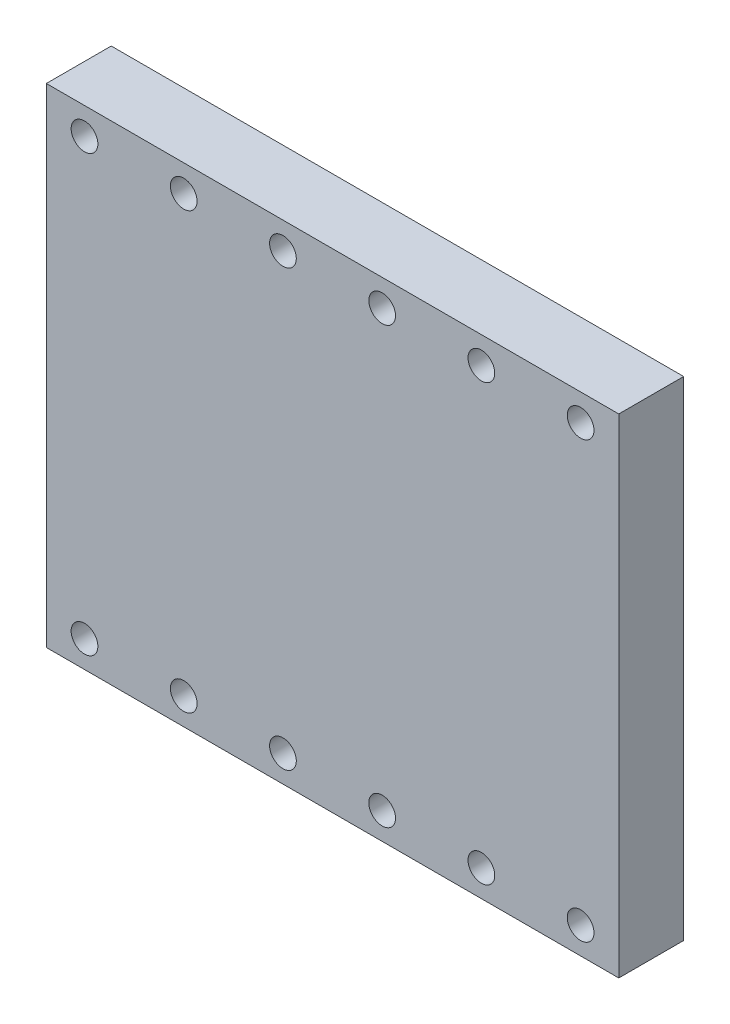
ISO-10303-21;
HEADER;
FILE_DESCRIPTION(('STEP AP214'),'2;1');
FILE_NAME('part.step','',(''),(''),'','','');
FILE_SCHEMA(('AUTOMOTIVE_DESIGN { 1 0 10303 214 1 1 1 1 }'));
ENDSEC;
DATA;
#1=APPLICATION_CONTEXT('core data for automotive mechanical design processes');
#2=APPLICATION_PROTOCOL_DEFINITION('international standard','automotive_design',2000,#1);
#3=PRODUCT_CONTEXT('',#1,'mechanical');
#4=PRODUCT('Part','Part','',(#3));
#5=PRODUCT_RELATED_PRODUCT_CATEGORY('part','',(#4));
#6=PRODUCT_DEFINITION_FORMATION('','',#4);
#7=PRODUCT_DEFINITION_CONTEXT('part definition',#1,'design');
#8=PRODUCT_DEFINITION('design','',#6,#7);
#9=PRODUCT_DEFINITION_SHAPE('','',#8);
#10=(LENGTH_UNIT() NAMED_UNIT(*) SI_UNIT(.MILLI.,.METRE.));
#11=(NAMED_UNIT(*) PLANE_ANGLE_UNIT() SI_UNIT($,.RADIAN.));
#12=(NAMED_UNIT(*) SI_UNIT($,.STERADIAN.) SOLID_ANGLE_UNIT());
#13=UNCERTAINTY_MEASURE_WITH_UNIT(LENGTH_MEASURE(1.E-05),#10,'distance_accuracy_value','');
#14=(GEOMETRIC_REPRESENTATION_CONTEXT(3) GLOBAL_UNCERTAINTY_ASSIGNED_CONTEXT((#13)) GLOBAL_UNIT_ASSIGNED_CONTEXT((#10,
#11,#12)) REPRESENTATION_CONTEXT('',''));
#15=CARTESIAN_POINT('',(0.,0.,0.));
#16=DIRECTION('',(0.,0.,1.));
#17=DIRECTION('',(1.,0.,0.));
#18=AXIS2_PLACEMENT_3D('',#15,#16,#17);
#19=CARTESIAN_POINT('',(0.,0.,0.));
#20=DIRECTION('',(0.,0.,-1.));
#21=DIRECTION('',(-1.,0.,0.));
#22=AXIS2_PLACEMENT_3D('',#19,#20,#21);
#23=PLANE('',#22);
#24=CARTESIAN_POINT('',(1.3,5.7,0.));
#25=DIRECTION('',(0.,0.,1.));
#26=DIRECTION('',(1.,0.,0.));
#27=AXIS2_PLACEMENT_3D('',#24,#25,#26);
#28=CIRCLE('',#27,0.35);
#29=CARTESIAN_POINT('',(1.65,5.7,0.));
#30=VERTEX_POINT('',#29);
#31=EDGE_CURVE('E476',#30,#30,#28,.T.);
#32=ORIENTED_EDGE('',*,*,#31,.T.);
#33=EDGE_LOOP('',(#32));
#34=FACE_BOUND('',#33,.T.);
#35=CARTESIAN_POINT('',(3.9,5.7,0.));
#36=DIRECTION('',(0.,0.,1.));
#37=DIRECTION('',(1.,0.,0.));
#38=AXIS2_PLACEMENT_3D('',#35,#36,#37);
#39=CIRCLE('',#38,0.35);
#40=CARTESIAN_POINT('',(4.25,5.7,0.));
#41=VERTEX_POINT('',#40);
#42=EDGE_CURVE('E472',#41,#41,#39,.T.);
#43=ORIENTED_EDGE('',*,*,#42,.T.);
#44=EDGE_LOOP('',(#43));
#45=FACE_BOUND('',#44,.T.);
#46=CARTESIAN_POINT('',(6.5,5.7,0.));
#47=DIRECTION('',(0.,0.,1.));
#48=DIRECTION('',(1.,0.,0.));
#49=AXIS2_PLACEMENT_3D('',#46,#47,#48);
#50=CIRCLE('',#49,0.350000000000001);
#51=CARTESIAN_POINT('',(6.85,5.7,0.));
#52=VERTEX_POINT('',#51);
#53=EDGE_CURVE('E466',#52,#52,#50,.T.);
#54=ORIENTED_EDGE('',*,*,#53,.T.);
#55=EDGE_LOOP('',(#54));
#56=FACE_BOUND('',#55,.T.);
#57=CARTESIAN_POINT('',(-6.5,5.7,0.));
#58=DIRECTION('',(0.,0.,1.));
#59=DIRECTION('',(1.,0.,0.));
#60=AXIS2_PLACEMENT_3D('',#57,#58,#59);
#61=CIRCLE('',#60,0.35);
#62=CARTESIAN_POINT('',(-6.15,5.7,0.));
#63=VERTEX_POINT('',#62);
#64=EDGE_CURVE('E458',#63,#63,#61,.T.);
#65=ORIENTED_EDGE('',*,*,#64,.T.);
#66=EDGE_LOOP('',(#65));
#67=FACE_BOUND('',#66,.T.);
#68=CARTESIAN_POINT('',(-3.9,5.7,0.));
#69=DIRECTION('',(0.,0.,1.));
#70=DIRECTION('',(1.,0.,0.));
#71=AXIS2_PLACEMENT_3D('',#68,#69,#70);
#72=CIRCLE('',#71,0.35);
#73=CARTESIAN_POINT('',(-3.55,5.7,0.));
#74=VERTEX_POINT('',#73);
#75=EDGE_CURVE('E452',#74,#74,#72,.T.);
#76=ORIENTED_EDGE('',*,*,#75,.T.);
#77=EDGE_LOOP('',(#76));
#78=FACE_BOUND('',#77,.T.);
#79=CARTESIAN_POINT('',(-1.3,5.7,0.));
#80=DIRECTION('',(0.,0.,1.));
#81=DIRECTION('',(1.,0.,0.));
#82=AXIS2_PLACEMENT_3D('',#79,#80,#81);
#83=CIRCLE('',#82,0.35);
#84=CARTESIAN_POINT('',(-0.95,5.7,0.));
#85=VERTEX_POINT('',#84);
#86=EDGE_CURVE('E460',#85,#85,#83,.T.);
#87=ORIENTED_EDGE('',*,*,#86,.T.);
#88=EDGE_LOOP('',(#87));
#89=FACE_BOUND('',#88,.T.);
#90=DIRECTION('',(1.,0.,0.));
#91=VECTOR('',#90,1.);
#92=CARTESIAN_POINT('',(-7.,0.6,0.));
#93=LINE('',#92,#91);
#94=CARTESIAN_POINT('',(-7.,0.6,0.));
#95=VERTEX_POINT('',#94);
#96=CARTESIAN_POINT('',(-5.,0.6,0.));
#97=VERTEX_POINT('',#96);
#98=EDGE_CURVE('E70',#95,#97,#93,.T.);
#99=ORIENTED_EDGE('',*,*,#98,.F.);
#100=DIRECTION('',(0.,-1.,0.));
#101=VECTOR('',#100,1.);
#102=CARTESIAN_POINT('',(-7.,0.6,0.));
#103=LINE('',#102,#101);
#104=CARTESIAN_POINT('',(-7.,-0.6,0.));
#105=VERTEX_POINT('',#104);
#106=EDGE_CURVE('E75',#95,#105,#103,.T.);
#107=ORIENTED_EDGE('',*,*,#106,.T.);
#108=DIRECTION('',(1.,0.,0.));
#109=VECTOR('',#108,1.);
#110=CARTESIAN_POINT('',(-7.,-0.6,0.));
#111=LINE('',#110,#109);
#112=CARTESIAN_POINT('',(-5.,-0.6,0.));
#113=VERTEX_POINT('',#112);
#114=EDGE_CURVE('E494',#105,#113,#111,.T.);
#115=ORIENTED_EDGE('',*,*,#114,.T.);
#116=DIRECTION('',(0.,-1.,0.));
#117=VECTOR('',#116,1.);
#118=CARTESIAN_POINT('',(-5.,0.6,0.));
#119=LINE('',#118,#117);
#120=EDGE_CURVE('E495',#97,#113,#119,.T.);
#121=ORIENTED_EDGE('',*,*,#120,.F.);
#122=EDGE_LOOP('',(#99,#107,#115,#121));
#123=FACE_BOUND('',#122,.T.);
#124=DIRECTION('',(1.,0.,0.));
#125=VECTOR('',#124,1.);
#126=CARTESIAN_POINT('',(-3.,0.6,0.));
#127=LINE('',#126,#125);
#128=CARTESIAN_POINT('',(-3.,0.6,0.));
#129=VERTEX_POINT('',#128);
#130=CARTESIAN_POINT('',(-1.,0.6,0.));
#131=VERTEX_POINT('',#130);
#132=EDGE_CURVE('E252',#129,#131,#127,.T.);
#133=ORIENTED_EDGE('',*,*,#132,.F.);
#134=DIRECTION('',(0.,-1.,0.));
#135=VECTOR('',#134,1.);
#136=CARTESIAN_POINT('',(-3.,0.6,0.));
#137=LINE('',#136,#135);
#138=CARTESIAN_POINT('',(-3.,-0.6,0.));
#139=VERTEX_POINT('',#138);
#140=EDGE_CURVE('E242',#129,#139,#137,.T.);
#141=ORIENTED_EDGE('',*,*,#140,.T.);
#142=DIRECTION('',(1.,0.,0.));
#143=VECTOR('',#142,1.);
#144=CARTESIAN_POINT('',(-3.,-0.6,0.));
#145=LINE('',#144,#143);
#146=CARTESIAN_POINT('',(-1.,-0.6,0.));
#147=VERTEX_POINT('',#146);
#148=EDGE_CURVE('E241',#139,#147,#145,.T.);
#149=ORIENTED_EDGE('',*,*,#148,.T.);
#150=DIRECTION('',(0.,-1.,0.));
#151=VECTOR('',#150,1.);
#152=CARTESIAN_POINT('',(-1.,0.6,0.));
#153=LINE('',#152,#151);
#154=EDGE_CURVE('E247',#131,#147,#153,.T.);
#155=ORIENTED_EDGE('',*,*,#154,.F.);
#156=EDGE_LOOP('',(#133,#141,#149,#155));
#157=FACE_BOUND('',#156,.T.);
#158=DIRECTION('',(1.,0.,0.));
#159=VECTOR('',#158,1.);
#160=CARTESIAN_POINT('',(-7.5,6.4,0.));
#161=LINE('',#160,#159);
#162=CARTESIAN_POINT('',(-7.5,6.4,0.));
#163=VERTEX_POINT('',#162);
#164=CARTESIAN_POINT('',(7.5,6.4,0.));
#165=VERTEX_POINT('',#164);
#166=EDGE_CURVE('E215',#163,#165,#161,.T.);
#167=ORIENTED_EDGE('',*,*,#166,.T.);
#168=DIRECTION('',(0.,-1.,0.));
#169=VECTOR('',#168,1.);
#170=CARTESIAN_POINT('',(7.5,6.4,0.));
#171=LINE('',#170,#169);
#172=CARTESIAN_POINT('',(7.5,-6.4,0.));
#173=VERTEX_POINT('',#172);
#174=EDGE_CURVE('E220',#165,#173,#171,.T.);
#175=ORIENTED_EDGE('',*,*,#174,.T.);
#176=DIRECTION('',(1.,0.,0.));
#177=VECTOR('',#176,1.);
#178=CARTESIAN_POINT('',(-7.5,-6.4,0.));
#179=LINE('',#178,#177);
#180=CARTESIAN_POINT('',(-7.5,-6.4,0.));
#181=VERTEX_POINT('',#180);
#182=EDGE_CURVE('E374',#181,#173,#179,.T.);
#183=ORIENTED_EDGE('',*,*,#182,.F.);
#184=DIRECTION('',(0.,-1.,0.));
#185=VECTOR('',#184,1.);
#186=CARTESIAN_POINT('',(-7.5,6.4,0.));
#187=LINE('',#186,#185);
#188=EDGE_CURVE('E362',#163,#181,#187,.T.);
#189=ORIENTED_EDGE('',*,*,#188,.F.);
#190=EDGE_LOOP('',(#167,#175,#183,#189));
#191=FACE_BOUND('',#190,.T.);
#192=DIRECTION('',(1.,0.,0.));
#193=VECTOR('',#192,1.);
#194=CARTESIAN_POINT('',(5.,0.6,0.));
#195=LINE('',#194,#193);
#196=CARTESIAN_POINT('',(5.,0.6,0.));
#197=VERTEX_POINT('',#196);
#198=CARTESIAN_POINT('',(7.,0.6,0.));
#199=VERTEX_POINT('',#198);
#200=EDGE_CURVE('E332',#197,#199,#195,.T.);
#201=ORIENTED_EDGE('',*,*,#200,.F.);
#202=DIRECTION('',(0.,-1.,0.));
#203=VECTOR('',#202,1.);
#204=CARTESIAN_POINT('',(5.,0.6,0.));
#205=LINE('',#204,#203);
#206=CARTESIAN_POINT('',(5.,-0.6,0.));
#207=VERTEX_POINT('',#206);
#208=EDGE_CURVE('E286',#197,#207,#205,.T.);
#209=ORIENTED_EDGE('',*,*,#208,.T.);
#210=DIRECTION('',(1.,0.,0.));
#211=VECTOR('',#210,1.);
#212=CARTESIAN_POINT('',(5.,-0.6,0.));
#213=LINE('',#212,#211);
#214=CARTESIAN_POINT('',(7.,-0.6,0.));
#215=VERTEX_POINT('',#214);
#216=EDGE_CURVE('E338',#207,#215,#213,.T.);
#217=ORIENTED_EDGE('',*,*,#216,.T.);
#218=DIRECTION('',(0.,-1.,0.));
#219=VECTOR('',#218,1.);
#220=CARTESIAN_POINT('',(7.,0.6,0.));
#221=LINE('',#220,#219);
#222=EDGE_CURVE('E333',#199,#215,#221,.T.);
#223=ORIENTED_EDGE('',*,*,#222,.F.);
#224=EDGE_LOOP('',(#201,#209,#217,#223));
#225=FACE_BOUND('',#224,.T.);
#226=DIRECTION('',(1.,0.,0.));
#227=VECTOR('',#226,1.);
#228=CARTESIAN_POINT('',(0.999999999999999,0.6,0.));
#229=LINE('',#228,#227);
#230=CARTESIAN_POINT('',(0.999999999999999,0.6,0.));
#231=VERTEX_POINT('',#230);
#232=CARTESIAN_POINT('',(3.,0.6,0.));
#233=VERTEX_POINT('',#232);
#234=EDGE_CURVE('E290',#231,#233,#229,.T.);
#235=ORIENTED_EDGE('',*,*,#234,.F.);
#236=DIRECTION('',(0.,-1.,0.));
#237=VECTOR('',#236,1.);
#238=CARTESIAN_POINT('',(0.999999999999999,0.6,0.));
#239=LINE('',#238,#237);
#240=CARTESIAN_POINT('',(0.999999999999999,-0.6,0.));
#241=VERTEX_POINT('',#240);
#242=EDGE_CURVE('E229',#231,#241,#239,.T.);
#243=ORIENTED_EDGE('',*,*,#242,.T.);
#244=DIRECTION('',(1.,0.,0.));
#245=VECTOR('',#244,1.);
#246=CARTESIAN_POINT('',(0.999999999999999,-0.6,0.));
#247=LINE('',#246,#245);
#248=CARTESIAN_POINT('',(3.,-0.6,0.));
#249=VERTEX_POINT('',#248);
#250=EDGE_CURVE('E297',#241,#249,#247,.T.);
#251=ORIENTED_EDGE('',*,*,#250,.T.);
#252=DIRECTION('',(0.,-1.,0.));
#253=VECTOR('',#252,1.);
#254=CARTESIAN_POINT('',(3.,0.6,0.));
#255=LINE('',#254,#253);
#256=EDGE_CURVE('E292',#233,#249,#255,.T.);
#257=ORIENTED_EDGE('',*,*,#256,.F.);
#258=EDGE_LOOP('',(#235,#243,#251,#257));
#259=FACE_BOUND('',#258,.T.);
#260=CARTESIAN_POINT('',(6.5,-5.7,0.));
#261=DIRECTION('',(0.,0.,-1.));
#262=DIRECTION('',(-1.,0.,0.));
#263=AXIS2_PLACEMENT_3D('',#260,#261,#262);
#264=CIRCLE('',#263,0.350000000000001);
#265=CARTESIAN_POINT('',(6.15,-5.7,0.));
#266=VERTEX_POINT('',#265);
#267=EDGE_CURVE('E984',#266,#266,#264,.T.);
#268=ORIENTED_EDGE('',*,*,#267,.F.);
#269=EDGE_LOOP('',(#268));
#270=FACE_BOUND('',#269,.T.);
#271=CARTESIAN_POINT('',(-6.5,-5.7,0.));
#272=DIRECTION('',(0.,0.,-1.));
#273=DIRECTION('',(-1.,0.,0.));
#274=AXIS2_PLACEMENT_3D('',#271,#272,#273);
#275=CIRCLE('',#274,0.35);
#276=CARTESIAN_POINT('',(-6.85,-5.7,0.));
#277=VERTEX_POINT('',#276);
#278=EDGE_CURVE('E991',#277,#277,#275,.T.);
#279=ORIENTED_EDGE('',*,*,#278,.F.);
#280=EDGE_LOOP('',(#279));
#281=FACE_BOUND('',#280,.T.);
#282=CARTESIAN_POINT('',(-3.9,-5.7,0.));
#283=DIRECTION('',(0.,0.,-1.));
#284=DIRECTION('',(-1.,0.,0.));
#285=AXIS2_PLACEMENT_3D('',#282,#283,#284);
#286=CIRCLE('',#285,0.35);
#287=CARTESIAN_POINT('',(-4.25,-5.7,0.));
#288=VERTEX_POINT('',#287);
#289=EDGE_CURVE('E993',#288,#288,#286,.T.);
#290=ORIENTED_EDGE('',*,*,#289,.F.);
#291=EDGE_LOOP('',(#290));
#292=FACE_BOUND('',#291,.T.);
#293=CARTESIAN_POINT('',(3.9,-5.7,0.));
#294=DIRECTION('',(0.,0.,-1.));
#295=DIRECTION('',(-1.,0.,0.));
#296=AXIS2_PLACEMENT_3D('',#293,#294,#295);
#297=CIRCLE('',#296,0.35);
#298=CARTESIAN_POINT('',(3.55,-5.7,0.));
#299=VERTEX_POINT('',#298);
#300=EDGE_CURVE('E982',#299,#299,#297,.T.);
#301=ORIENTED_EDGE('',*,*,#300,.F.);
#302=EDGE_LOOP('',(#301));
#303=FACE_BOUND('',#302,.T.);
#304=CARTESIAN_POINT('',(1.3,-5.7,0.));
#305=DIRECTION('',(0.,0.,-1.));
#306=DIRECTION('',(-1.,0.,0.));
#307=AXIS2_PLACEMENT_3D('',#304,#305,#306);
#308=CIRCLE('',#307,0.35);
#309=CARTESIAN_POINT('',(0.95,-5.7,0.));
#310=VERTEX_POINT('',#309);
#311=EDGE_CURVE('E442',#310,#310,#308,.T.);
#312=ORIENTED_EDGE('',*,*,#311,.F.);
#313=EDGE_LOOP('',(#312));
#314=FACE_BOUND('',#313,.T.);
#315=CARTESIAN_POINT('',(-1.3,-5.7,0.));
#316=DIRECTION('',(0.,0.,-1.));
#317=DIRECTION('',(-1.,0.,0.));
#318=AXIS2_PLACEMENT_3D('',#315,#316,#317);
#319=CIRCLE('',#318,0.35);
#320=CARTESIAN_POINT('',(-1.65,-5.7,0.));
#321=VERTEX_POINT('',#320);
#322=EDGE_CURVE('E439',#321,#321,#319,.T.);
#323=ORIENTED_EDGE('',*,*,#322,.F.);
#324=EDGE_LOOP('',(#323));
#325=FACE_BOUND('',#324,.T.);
#326=ADVANCED_FACE('F47',(#34,#45,#56,#67,#78,#89,#123,#157,#191,#225,#259,#270,#281,#292,#303,
#314,#325),#23,.T.);
#327=CARTESIAN_POINT('',(0.,0.,1.7));
#328=DIRECTION('',(0.,0.,-1.));
#329=DIRECTION('',(-1.,0.,0.));
#330=AXIS2_PLACEMENT_3D('',#327,#328,#329);
#331=PLANE('',#330);
#332=CARTESIAN_POINT('',(1.3,5.7,1.7));
#333=DIRECTION('',(0.,0.,1.));
#334=DIRECTION('',(1.,0.,0.));
#335=AXIS2_PLACEMENT_3D('',#332,#333,#334);
#336=CIRCLE('',#335,0.35);
#337=CARTESIAN_POINT('',(1.65,5.7,1.7));
#338=VERTEX_POINT('',#337);
#339=EDGE_CURVE('E447',#338,#338,#336,.T.);
#340=ORIENTED_EDGE('',*,*,#339,.F.);
#341=EDGE_LOOP('',(#340));
#342=FACE_BOUND('',#341,.T.);
#343=CARTESIAN_POINT('',(1.3,-5.7,1.7));
#344=DIRECTION('',(0.,0.,-1.));
#345=DIRECTION('',(-1.,0.,0.));
#346=AXIS2_PLACEMENT_3D('',#343,#344,#345);
#347=CIRCLE('',#346,0.35);
#348=CARTESIAN_POINT('',(0.95,-5.7,1.7));
#349=VERTEX_POINT('',#348);
#350=EDGE_CURVE('E446',#349,#349,#347,.T.);
#351=ORIENTED_EDGE('',*,*,#350,.T.);
#352=EDGE_LOOP('',(#351));
#353=FACE_BOUND('',#352,.T.);
#354=CARTESIAN_POINT('',(-3.9,-5.7,1.7));
#355=DIRECTION('',(0.,0.,-1.));
#356=DIRECTION('',(-1.,0.,0.));
#357=AXIS2_PLACEMENT_3D('',#354,#355,#356);
#358=CIRCLE('',#357,0.35);
#359=CARTESIAN_POINT('',(-4.25,-5.7,1.7));
#360=VERTEX_POINT('',#359);
#361=EDGE_CURVE('E1007',#360,#360,#358,.T.);
#362=ORIENTED_EDGE('',*,*,#361,.T.);
#363=EDGE_LOOP('',(#362));
#364=FACE_BOUND('',#363,.T.);
#365=CARTESIAN_POINT('',(6.5,-5.7,1.7));
#366=DIRECTION('',(0.,0.,-1.));
#367=DIRECTION('',(-1.,0.,0.));
#368=AXIS2_PLACEMENT_3D('',#365,#366,#367);
#369=CIRCLE('',#368,0.350000000000001);
#370=CARTESIAN_POINT('',(6.15,-5.7,1.7));
#371=VERTEX_POINT('',#370);
#372=EDGE_CURVE('E996',#371,#371,#369,.T.);
#373=ORIENTED_EDGE('',*,*,#372,.T.);
#374=EDGE_LOOP('',(#373));
#375=FACE_BOUND('',#374,.T.);
#376=CARTESIAN_POINT('',(-1.3,5.7,1.7));
#377=DIRECTION('',(0.,0.,1.));
#378=DIRECTION('',(1.,0.,0.));
#379=AXIS2_PLACEMENT_3D('',#376,#377,#378);
#380=CIRCLE('',#379,0.35);
#381=CARTESIAN_POINT('',(-0.95,5.7,1.7));
#382=VERTEX_POINT('',#381);
#383=EDGE_CURVE('E329',#382,#382,#380,.T.);
#384=ORIENTED_EDGE('',*,*,#383,.F.);
#385=EDGE_LOOP('',(#384));
#386=FACE_BOUND('',#385,.T.);
#387=DIRECTION('',(1.,0.,0.));
#388=VECTOR('',#387,1.);
#389=CARTESIAN_POINT('',(-7.5,6.4,1.7));
#390=LINE('',#389,#388);
#391=CARTESIAN_POINT('',(-7.5,6.4,1.7));
#392=VERTEX_POINT('',#391);
#393=CARTESIAN_POINT('',(7.5,6.4,1.7));
#394=VERTEX_POINT('',#393);
#395=EDGE_CURVE('E360',#392,#394,#390,.T.);
#396=ORIENTED_EDGE('',*,*,#395,.F.);
#397=DIRECTION('',(0.,-1.,0.));
#398=VECTOR('',#397,1.);
#399=CARTESIAN_POINT('',(-7.5,6.4,1.7));
#400=LINE('',#399,#398);
#401=CARTESIAN_POINT('',(-7.5,-6.4,1.7));
#402=VERTEX_POINT('',#401);
#403=EDGE_CURVE('E369',#392,#402,#400,.T.);
#404=ORIENTED_EDGE('',*,*,#403,.T.);
#405=DIRECTION('',(1.,0.,0.));
#406=VECTOR('',#405,1.);
#407=CARTESIAN_POINT('',(-7.5,-6.4,1.7));
#408=LINE('',#407,#406);
#409=CARTESIAN_POINT('',(7.5,-6.4,1.7));
#410=VERTEX_POINT('',#409);
#411=EDGE_CURVE('E368',#402,#410,#408,.T.);
#412=ORIENTED_EDGE('',*,*,#411,.T.);
#413=DIRECTION('',(0.,-1.,0.));
#414=VECTOR('',#413,1.);
#415=CARTESIAN_POINT('',(7.5,6.4,1.7));
#416=LINE('',#415,#414);
#417=EDGE_CURVE('E363',#394,#410,#416,.T.);
#418=ORIENTED_EDGE('',*,*,#417,.F.);
#419=EDGE_LOOP('',(#396,#404,#412,#418));
#420=FACE_BOUND('',#419,.T.);
#421=CARTESIAN_POINT('',(-6.5,-5.7,1.7));
#422=DIRECTION('',(0.,0.,-1.));
#423=DIRECTION('',(-1.,0.,0.));
#424=AXIS2_PLACEMENT_3D('',#421,#422,#423);
#425=CIRCLE('',#424,0.35);
#426=CARTESIAN_POINT('',(-6.85,-5.7,1.7));
#427=VERTEX_POINT('',#426);
#428=EDGE_CURVE('E413',#427,#427,#425,.T.);
#429=ORIENTED_EDGE('',*,*,#428,.T.);
#430=EDGE_LOOP('',(#429));
#431=FACE_BOUND('',#430,.T.);
#432=CARTESIAN_POINT('',(-3.9,5.7,1.7));
#433=DIRECTION('',(0.,0.,1.));
#434=DIRECTION('',(1.,0.,0.));
#435=AXIS2_PLACEMENT_3D('',#432,#433,#434);
#436=CIRCLE('',#435,0.35);
#437=CARTESIAN_POINT('',(-3.55,5.7,1.7));
#438=VERTEX_POINT('',#437);
#439=EDGE_CURVE('E416',#438,#438,#436,.T.);
#440=ORIENTED_EDGE('',*,*,#439,.F.);
#441=EDGE_LOOP('',(#440));
#442=FACE_BOUND('',#441,.T.);
#443=CARTESIAN_POINT('',(-6.5,5.7,1.7));
#444=DIRECTION('',(0.,0.,1.));
#445=DIRECTION('',(1.,0.,0.));
#446=AXIS2_PLACEMENT_3D('',#443,#444,#445);
#447=CIRCLE('',#446,0.35);
#448=CARTESIAN_POINT('',(-6.15,5.7,1.7));
#449=VERTEX_POINT('',#448);
#450=EDGE_CURVE('E425',#449,#449,#447,.T.);
#451=ORIENTED_EDGE('',*,*,#450,.F.);
#452=EDGE_LOOP('',(#451));
#453=FACE_BOUND('',#452,.T.);
#454=CARTESIAN_POINT('',(6.5,5.7,1.7));
#455=DIRECTION('',(0.,0.,1.));
#456=DIRECTION('',(1.,0.,0.));
#457=AXIS2_PLACEMENT_3D('',#454,#455,#456);
#458=CIRCLE('',#457,0.350000000000001);
#459=CARTESIAN_POINT('',(6.85,5.7,1.7));
#460=VERTEX_POINT('',#459);
#461=EDGE_CURVE('E426',#460,#460,#458,.T.);
#462=ORIENTED_EDGE('',*,*,#461,.F.);
#463=EDGE_LOOP('',(#462));
#464=FACE_BOUND('',#463,.T.);
#465=CARTESIAN_POINT('',(3.9,5.7,1.7));
#466=DIRECTION('',(0.,0.,1.));
#467=DIRECTION('',(1.,0.,0.));
#468=AXIS2_PLACEMENT_3D('',#465,#466,#467);
#469=CIRCLE('',#468,0.35);
#470=CARTESIAN_POINT('',(4.25,5.7,1.7));
#471=VERTEX_POINT('',#470);
#472=EDGE_CURVE('E429',#471,#471,#469,.T.);
#473=ORIENTED_EDGE('',*,*,#472,.F.);
#474=EDGE_LOOP('',(#473));
#475=FACE_BOUND('',#474,.T.);
#476=CARTESIAN_POINT('',(3.9,-5.7,1.7));
#477=DIRECTION('',(0.,0.,-1.));
#478=DIRECTION('',(-1.,0.,0.));
#479=AXIS2_PLACEMENT_3D('',#476,#477,#478);
#480=CIRCLE('',#479,0.35);
#481=CARTESIAN_POINT('',(3.55,-5.7,1.7));
#482=VERTEX_POINT('',#481);
#483=EDGE_CURVE('E432',#482,#482,#480,.T.);
#484=ORIENTED_EDGE('',*,*,#483,.T.);
#485=EDGE_LOOP('',(#484));
#486=FACE_BOUND('',#485,.T.);
#487=CARTESIAN_POINT('',(-1.3,-5.7,1.7));
#488=DIRECTION('',(0.,0.,-1.));
#489=DIRECTION('',(-1.,0.,0.));
#490=AXIS2_PLACEMENT_3D('',#487,#488,#489);
#491=CIRCLE('',#490,0.35);
#492=CARTESIAN_POINT('',(-1.65,-5.7,1.7));
#493=VERTEX_POINT('',#492);
#494=EDGE_CURVE('E440',#493,#493,#491,.T.);
#495=ORIENTED_EDGE('',*,*,#494,.T.);
#496=EDGE_LOOP('',(#495));
#497=FACE_BOUND('',#496,.T.);
#498=ADVANCED_FACE('F407',(#342,#353,#364,#375,#386,#420,#431,#442,#453,#464,#475,#486,#497),
#331,.F.);
#499=CARTESIAN_POINT('',(-7.5,6.4,1.7));
#500=DIRECTION('',(0.,1.,0.));
#501=DIRECTION('',(-1.,0.,0.));
#502=AXIS2_PLACEMENT_3D('',#499,#500,#501);
#503=PLANE('',#502);
#504=ORIENTED_EDGE('',*,*,#166,.F.);
#505=DIRECTION('',(0.,0.,-1.));
#506=VECTOR('',#505,1.);
#507=CARTESIAN_POINT('',(-7.5,6.4,1.7));
#508=LINE('',#507,#506);
#509=EDGE_CURVE('E11',#392,#163,#508,.T.);
#510=ORIENTED_EDGE('',*,*,#509,.F.);
#511=ORIENTED_EDGE('',*,*,#395,.T.);
#512=DIRECTION('',(0.,0.,-1.));
#513=VECTOR('',#512,1.);
#514=CARTESIAN_POINT('',(7.5,6.4,1.7));
#515=LINE('',#514,#513);
#516=EDGE_CURVE('E52',#394,#165,#515,.T.);
#517=ORIENTED_EDGE('',*,*,#516,.T.);
#518=EDGE_LOOP('',(#504,#510,#511,#517));
#519=FACE_BOUND('',#518,.T.);
#520=ADVANCED_FACE('F51',(#519),#503,.T.);
#521=CARTESIAN_POINT('',(-7.5,6.4,1.7));
#522=DIRECTION('',(1.,0.,0.));
#523=DIRECTION('',(0.,1.,0.));
#524=AXIS2_PLACEMENT_3D('',#521,#522,#523);
#525=PLANE('',#524);
#526=ORIENTED_EDGE('',*,*,#188,.T.);
#527=DIRECTION('',(0.,0.,-1.));
#528=VECTOR('',#527,1.);
#529=CARTESIAN_POINT('',(-7.5,-6.4,1.7));
#530=LINE('',#529,#528);
#531=EDGE_CURVE('E56',#402,#181,#530,.T.);
#532=ORIENTED_EDGE('',*,*,#531,.F.);
#533=ORIENTED_EDGE('',*,*,#403,.F.);
#534=ORIENTED_EDGE('',*,*,#509,.T.);
#535=EDGE_LOOP('',(#526,#532,#533,#534));
#536=FACE_BOUND('',#535,.T.);
#537=ADVANCED_FACE('F399',(#536),#525,.F.);
#538=CARTESIAN_POINT('',(-7.5,-6.4,1.7));
#539=DIRECTION('',(0.,1.,0.));
#540=DIRECTION('',(-1.,0.,0.));
#541=AXIS2_PLACEMENT_3D('',#538,#539,#540);
#542=PLANE('',#541);
#543=ORIENTED_EDGE('',*,*,#182,.T.);
#544=DIRECTION('',(0.,0.,-1.));
#545=VECTOR('',#544,1.);
#546=CARTESIAN_POINT('',(7.5,-6.4,1.7));
#547=LINE('',#546,#545);
#548=EDGE_CURVE('E382',#410,#173,#547,.T.);
#549=ORIENTED_EDGE('',*,*,#548,.F.);
#550=ORIENTED_EDGE('',*,*,#411,.F.);
#551=ORIENTED_EDGE('',*,*,#531,.T.);
#552=EDGE_LOOP('',(#543,#549,#550,#551));
#553=FACE_BOUND('',#552,.T.);
#554=ADVANCED_FACE('F404',(#553),#542,.F.);
#555=CARTESIAN_POINT('',(7.5,6.4,1.7));
#556=DIRECTION('',(1.,0.,0.));
#557=DIRECTION('',(0.,1.,0.));
#558=AXIS2_PLACEMENT_3D('',#555,#556,#557);
#559=PLANE('',#558);
#560=ORIENTED_EDGE('',*,*,#174,.F.);
#561=ORIENTED_EDGE('',*,*,#516,.F.);
#562=ORIENTED_EDGE('',*,*,#417,.T.);
#563=ORIENTED_EDGE('',*,*,#548,.T.);
#564=EDGE_LOOP('',(#560,#561,#562,#563));
#565=FACE_BOUND('',#564,.T.);
#566=ADVANCED_FACE('F394',(#565),#559,.T.);
#567=CARTESIAN_POINT('',(5.,0.6,-0.5));
#568=DIRECTION('',(-1.,0.,0.));
#569=DIRECTION('',(0.,0.,1.));
#570=AXIS2_PLACEMENT_3D('',#567,#568,#569);
#571=PLANE('',#570);
#572=ORIENTED_EDGE('',*,*,#208,.F.);
#573=DIRECTION('',(0.,0.,1.));
#574=VECTOR('',#573,1.);
#575=CARTESIAN_POINT('',(5.,0.6,-0.5));
#576=LINE('',#575,#574);
#577=CARTESIAN_POINT('',(5.,0.6,-0.5));
#578=VERTEX_POINT('',#577);
#579=EDGE_CURVE('E326',#578,#197,#576,.T.);
#580=ORIENTED_EDGE('',*,*,#579,.F.);
#581=DIRECTION('',(0.,-1.,0.));
#582=VECTOR('',#581,1.);
#583=CARTESIAN_POINT('',(5.,0.6,-0.5));
#584=LINE('',#583,#582);
#585=CARTESIAN_POINT('',(5.,-0.6,-0.5));
#586=VERTEX_POINT('',#585);
#587=EDGE_CURVE('E337',#578,#586,#584,.T.);
#588=ORIENTED_EDGE('',*,*,#587,.T.);
#589=DIRECTION('',(0.,0.,1.));
#590=VECTOR('',#589,1.);
#591=CARTESIAN_POINT('',(5.,-0.6,-0.5));
#592=LINE('',#591,#590);
#593=EDGE_CURVE('E311',#586,#207,#592,.T.);
#594=ORIENTED_EDGE('',*,*,#593,.T.);
#595=EDGE_LOOP('',(#572,#580,#588,#594));
#596=FACE_BOUND('',#595,.T.);
#597=ADVANCED_FACE('F556',(#596),#571,.T.);
#598=CARTESIAN_POINT('',(5.,0.6,-0.5));
#599=DIRECTION('',(0.,-1.,0.));
#600=DIRECTION('',(0.,0.,-1.));
#601=AXIS2_PLACEMENT_3D('',#598,#599,#600);
#602=PLANE('',#601);
#603=ORIENTED_EDGE('',*,*,#200,.T.);
#604=DIRECTION('',(0.,0.,1.));
#605=VECTOR('',#604,1.);
#606=CARTESIAN_POINT('',(7.,0.6,-0.5));
#607=LINE('',#606,#605);
#608=CARTESIAN_POINT('',(7.,0.6,-0.5));
#609=VERTEX_POINT('',#608);
#610=EDGE_CURVE('E325',#609,#199,#607,.T.);
#611=ORIENTED_EDGE('',*,*,#610,.F.);
#612=DIRECTION('',(1.,0.,0.));
#613=VECTOR('',#612,1.);
#614=CARTESIAN_POINT('',(5.,0.6,-0.5));
#615=LINE('',#614,#613);
#616=EDGE_CURVE('E320',#578,#609,#615,.T.);
#617=ORIENTED_EDGE('',*,*,#616,.F.);
#618=ORIENTED_EDGE('',*,*,#579,.T.);
#619=EDGE_LOOP('',(#603,#611,#617,#618));
#620=FACE_BOUND('',#619,.T.);
#621=ADVANCED_FACE('F565',(#620),#602,.F.);
#622=CARTESIAN_POINT('',(7.,0.6,-0.5));
#623=DIRECTION('',(-1.,0.,0.));
#624=DIRECTION('',(0.,0.,1.));
#625=AXIS2_PLACEMENT_3D('',#622,#623,#624);
#626=PLANE('',#625);
#627=ORIENTED_EDGE('',*,*,#222,.T.);
#628=DIRECTION('',(0.,0.,1.));
#629=VECTOR('',#628,1.);
#630=CARTESIAN_POINT('',(7.,-0.6,-0.5));
#631=LINE('',#630,#629);
#632=CARTESIAN_POINT('',(7.,-0.6,-0.5));
#633=VERTEX_POINT('',#632);
#634=EDGE_CURVE('E318',#633,#215,#631,.T.);
#635=ORIENTED_EDGE('',*,*,#634,.F.);
#636=DIRECTION('',(0.,-1.,0.));
#637=VECTOR('',#636,1.);
#638=CARTESIAN_POINT('',(7.,0.6,-0.5));
#639=LINE('',#638,#637);
#640=EDGE_CURVE('E350',#609,#633,#639,.T.);
#641=ORIENTED_EDGE('',*,*,#640,.F.);
#642=ORIENTED_EDGE('',*,*,#610,.T.);
#643=EDGE_LOOP('',(#627,#635,#641,#642));
#644=FACE_BOUND('',#643,.T.);
#645=ADVANCED_FACE('F570',(#644),#626,.F.);
#646=CARTESIAN_POINT('',(5.,-0.6,-0.5));
#647=DIRECTION('',(0.,-1.,0.));
#648=DIRECTION('',(0.,0.,-1.));
#649=AXIS2_PLACEMENT_3D('',#646,#647,#648);
#650=PLANE('',#649);
#651=ORIENTED_EDGE('',*,*,#216,.F.);
#652=ORIENTED_EDGE('',*,*,#593,.F.);
#653=DIRECTION('',(1.,0.,0.));
#654=VECTOR('',#653,1.);
#655=CARTESIAN_POINT('',(5.,-0.6,-0.5));
#656=LINE('',#655,#654);
#657=EDGE_CURVE('E348',#586,#633,#656,.T.);
#658=ORIENTED_EDGE('',*,*,#657,.T.);
#659=ORIENTED_EDGE('',*,*,#634,.T.);
#660=EDGE_LOOP('',(#651,#652,#658,#659));
#661=FACE_BOUND('',#660,.T.);
#662=ADVANCED_FACE('F563',(#661),#650,.T.);
#663=CARTESIAN_POINT('',(0.,0.,-0.5));
#664=DIRECTION('',(0.,0.,1.));
#665=DIRECTION('',(1.,0.,0.));
#666=AXIS2_PLACEMENT_3D('',#663,#664,#665);
#667=PLANE('',#666);
#668=ORIENTED_EDGE('',*,*,#587,.F.);
#669=ORIENTED_EDGE('',*,*,#616,.T.);
#670=ORIENTED_EDGE('',*,*,#640,.T.);
#671=ORIENTED_EDGE('',*,*,#657,.F.);
#672=EDGE_LOOP('',(#668,#669,#670,#671));
#673=FACE_BOUND('',#672,.T.);
#674=ADVANCED_FACE('F545',(#673),#667,.F.);
#675=CARTESIAN_POINT('',(0.999999999999999,0.6,-0.5));
#676=DIRECTION('',(-1.,0.,0.));
#677=DIRECTION('',(0.,0.,1.));
#678=AXIS2_PLACEMENT_3D('',#675,#676,#677);
#679=PLANE('',#678);
#680=ORIENTED_EDGE('',*,*,#242,.F.);
#681=DIRECTION('',(0.,0.,1.));
#682=VECTOR('',#681,1.);
#683=CARTESIAN_POINT('',(0.999999999999999,0.6,-0.5));
#684=LINE('',#683,#682);
#685=CARTESIAN_POINT('',(0.999999999999999,0.6,-0.5));
#686=VERTEX_POINT('',#685);
#687=EDGE_CURVE('E285',#686,#231,#684,.T.);
#688=ORIENTED_EDGE('',*,*,#687,.F.);
#689=DIRECTION('',(0.,-1.,0.));
#690=VECTOR('',#689,1.);
#691=CARTESIAN_POINT('',(0.999999999999999,0.6,-0.5));
#692=LINE('',#691,#690);
#693=CARTESIAN_POINT('',(0.999999999999999,-0.6,-0.5));
#694=VERTEX_POINT('',#693);
#695=EDGE_CURVE('E295',#686,#694,#692,.T.);
#696=ORIENTED_EDGE('',*,*,#695,.T.);
#697=DIRECTION('',(0.,0.,1.));
#698=VECTOR('',#697,1.);
#699=CARTESIAN_POINT('',(0.999999999999999,-0.6,-0.5));
#700=LINE('',#699,#698);
#701=EDGE_CURVE('E267',#694,#241,#700,.T.);
#702=ORIENTED_EDGE('',*,*,#701,.T.);
#703=EDGE_LOOP('',(#680,#688,#696,#702));
#704=FACE_BOUND('',#703,.T.);
#705=ADVANCED_FACE('F538',(#704),#679,.T.);
#706=CARTESIAN_POINT('',(0.999999999999999,0.6,-0.5));
#707=DIRECTION('',(0.,-1.,0.));
#708=DIRECTION('',(0.,0.,-1.));
#709=AXIS2_PLACEMENT_3D('',#706,#707,#708);
#710=PLANE('',#709);
#711=ORIENTED_EDGE('',*,*,#234,.T.);
#712=DIRECTION('',(0.,0.,1.));
#713=VECTOR('',#712,1.);
#714=CARTESIAN_POINT('',(3.,0.6,-0.5));
#715=LINE('',#714,#713);
#716=CARTESIAN_POINT('',(3.,0.6,-0.5));
#717=VERTEX_POINT('',#716);
#718=EDGE_CURVE('E279',#717,#233,#715,.T.);
#719=ORIENTED_EDGE('',*,*,#718,.F.);
#720=DIRECTION('',(1.,0.,0.));
#721=VECTOR('',#720,1.);
#722=CARTESIAN_POINT('',(0.999999999999999,0.6,-0.5));
#723=LINE('',#722,#721);
#724=EDGE_CURVE('E272',#686,#717,#723,.T.);
#725=ORIENTED_EDGE('',*,*,#724,.F.);
#726=ORIENTED_EDGE('',*,*,#687,.T.);
#727=EDGE_LOOP('',(#711,#719,#725,#726));
#728=FACE_BOUND('',#727,.T.);
#729=ADVANCED_FACE('F541',(#728),#710,.F.);
#730=CARTESIAN_POINT('',(3.,0.6,-0.5));
#731=DIRECTION('',(-1.,0.,0.));
#732=DIRECTION('',(0.,0.,1.));
#733=AXIS2_PLACEMENT_3D('',#730,#731,#732);
#734=PLANE('',#733);
#735=ORIENTED_EDGE('',*,*,#256,.T.);
#736=DIRECTION('',(0.,0.,1.));
#737=VECTOR('',#736,1.);
#738=CARTESIAN_POINT('',(3.,-0.6,-0.5));
#739=LINE('',#738,#737);
#740=CARTESIAN_POINT('',(3.,-0.6,-0.5));
#741=VERTEX_POINT('',#740);
#742=EDGE_CURVE('E273',#741,#249,#739,.T.);
#743=ORIENTED_EDGE('',*,*,#742,.F.);
#744=DIRECTION('',(0.,-1.,0.));
#745=VECTOR('',#744,1.);
#746=CARTESIAN_POINT('',(3.,0.6,-0.5));
#747=LINE('',#746,#745);
#748=EDGE_CURVE('E302',#717,#741,#747,.T.);
#749=ORIENTED_EDGE('',*,*,#748,.F.);
#750=ORIENTED_EDGE('',*,*,#718,.T.);
#751=EDGE_LOOP('',(#735,#743,#749,#750));
#752=FACE_BOUND('',#751,.T.);
#753=ADVANCED_FACE('F547',(#752),#734,.F.);
#754=CARTESIAN_POINT('',(0.999999999999999,-0.6,-0.5));
#755=DIRECTION('',(0.,-1.,0.));
#756=DIRECTION('',(0.,0.,-1.));
#757=AXIS2_PLACEMENT_3D('',#754,#755,#756);
#758=PLANE('',#757);
#759=ORIENTED_EDGE('',*,*,#250,.F.);
#760=ORIENTED_EDGE('',*,*,#701,.F.);
#761=DIRECTION('',(1.,0.,0.));
#762=VECTOR('',#761,1.);
#763=CARTESIAN_POINT('',(0.999999999999999,-0.6,-0.5));
#764=LINE('',#763,#762);
#765=EDGE_CURVE('E308',#694,#741,#764,.T.);
#766=ORIENTED_EDGE('',*,*,#765,.T.);
#767=ORIENTED_EDGE('',*,*,#742,.T.);
#768=EDGE_LOOP('',(#759,#760,#766,#767));
#769=FACE_BOUND('',#768,.T.);
#770=ADVANCED_FACE('F542',(#769),#758,.T.);
#771=CARTESIAN_POINT('',(0.,0.,-0.5));
#772=DIRECTION('',(0.,0.,1.));
#773=DIRECTION('',(1.,0.,0.));
#774=AXIS2_PLACEMENT_3D('',#771,#772,#773);
#775=PLANE('',#774);
#776=ORIENTED_EDGE('',*,*,#695,.F.);
#777=ORIENTED_EDGE('',*,*,#724,.T.);
#778=ORIENTED_EDGE('',*,*,#748,.T.);
#779=ORIENTED_EDGE('',*,*,#765,.F.);
#780=EDGE_LOOP('',(#776,#777,#778,#779));
#781=FACE_BOUND('',#780,.T.);
#782=ADVANCED_FACE('F550',(#781),#775,.F.);
#783=CARTESIAN_POINT('',(-3.,0.6,-0.5));
#784=DIRECTION('',(0.,-1.,0.));
#785=DIRECTION('',(0.,0.,-1.));
#786=AXIS2_PLACEMENT_3D('',#783,#784,#785);
#787=PLANE('',#786);
#788=ORIENTED_EDGE('',*,*,#132,.T.);
#789=DIRECTION('',(0.,0.,1.));
#790=VECTOR('',#789,1.);
#791=CARTESIAN_POINT('',(-1.,0.6,-0.5));
#792=LINE('',#791,#790);
#793=CARTESIAN_POINT('',(-1.,0.6,-0.5));
#794=VERTEX_POINT('',#793);
#795=EDGE_CURVE('E224',#794,#131,#792,.T.);
#796=ORIENTED_EDGE('',*,*,#795,.F.);
#797=DIRECTION('',(1.,0.,0.));
#798=VECTOR('',#797,1.);
#799=CARTESIAN_POINT('',(-3.,0.6,-0.5));
#800=LINE('',#799,#798);
#801=CARTESIAN_POINT('',(-3.,0.6,-0.5));
#802=VERTEX_POINT('',#801);
#803=EDGE_CURVE('E243',#802,#794,#800,.T.);
#804=ORIENTED_EDGE('',*,*,#803,.F.);
#805=DIRECTION('',(0.,0.,1.));
#806=VECTOR('',#805,1.);
#807=CARTESIAN_POINT('',(-3.,0.6,-0.5));
#808=LINE('',#807,#806);
#809=EDGE_CURVE('E237',#802,#129,#808,.T.);
#810=ORIENTED_EDGE('',*,*,#809,.T.);
#811=EDGE_LOOP('',(#788,#796,#804,#810));
#812=FACE_BOUND('',#811,.T.);
#813=ADVANCED_FACE('F513',(#812),#787,.F.);
#814=CARTESIAN_POINT('',(-1.,0.6,-0.5));
#815=DIRECTION('',(-1.,0.,0.));
#816=DIRECTION('',(0.,0.,1.));
#817=AXIS2_PLACEMENT_3D('',#814,#815,#816);
#818=PLANE('',#817);
#819=ORIENTED_EDGE('',*,*,#154,.T.);
#820=DIRECTION('',(0.,0.,1.));
#821=VECTOR('',#820,1.);
#822=CARTESIAN_POINT('',(-1.,-0.6,-0.5));
#823=LINE('',#822,#821);
#824=CARTESIAN_POINT('',(-1.,-0.6,-0.5));
#825=VERTEX_POINT('',#824);
#826=EDGE_CURVE('E230',#825,#147,#823,.T.);
#827=ORIENTED_EDGE('',*,*,#826,.F.);
#828=DIRECTION('',(0.,-1.,0.));
#829=VECTOR('',#828,1.);
#830=CARTESIAN_POINT('',(-1.,0.6,-0.5));
#831=LINE('',#830,#829);
#832=EDGE_CURVE('E263',#794,#825,#831,.T.);
#833=ORIENTED_EDGE('',*,*,#832,.F.);
#834=ORIENTED_EDGE('',*,*,#795,.T.);
#835=EDGE_LOOP('',(#819,#827,#833,#834));
#836=FACE_BOUND('',#835,.T.);
#837=ADVANCED_FACE('F524',(#836),#818,.F.);
#838=CARTESIAN_POINT('',(-3.,-0.6,-0.5));
#839=DIRECTION('',(0.,-1.,0.));
#840=DIRECTION('',(0.,0.,-1.));
#841=AXIS2_PLACEMENT_3D('',#838,#839,#840);
#842=PLANE('',#841);
#843=ORIENTED_EDGE('',*,*,#148,.F.);
#844=DIRECTION('',(0.,0.,1.));
#845=VECTOR('',#844,1.);
#846=CARTESIAN_POINT('',(-3.,-0.6,-0.5));
#847=LINE('',#846,#845);
#848=CARTESIAN_POINT('',(-3.,-0.6,-0.5));
#849=VERTEX_POINT('',#848);
#850=EDGE_CURVE('E235',#849,#139,#847,.T.);
#851=ORIENTED_EDGE('',*,*,#850,.F.);
#852=DIRECTION('',(1.,0.,0.));
#853=VECTOR('',#852,1.);
#854=CARTESIAN_POINT('',(-3.,-0.6,-0.5));
#855=LINE('',#854,#853);
#856=EDGE_CURVE('E259',#849,#825,#855,.T.);
#857=ORIENTED_EDGE('',*,*,#856,.T.);
#858=ORIENTED_EDGE('',*,*,#826,.T.);
#859=EDGE_LOOP('',(#843,#851,#857,#858));
#860=FACE_BOUND('',#859,.T.);
#861=ADVANCED_FACE('F525',(#860),#842,.T.);
#862=CARTESIAN_POINT('',(-3.,0.6,-0.5));
#863=DIRECTION('',(-1.,0.,0.));
#864=DIRECTION('',(0.,0.,1.));
#865=AXIS2_PLACEMENT_3D('',#862,#863,#864);
#866=PLANE('',#865);
#867=ORIENTED_EDGE('',*,*,#140,.F.);
#868=ORIENTED_EDGE('',*,*,#809,.F.);
#869=DIRECTION('',(0.,-1.,0.));
#870=VECTOR('',#869,1.);
#871=CARTESIAN_POINT('',(-3.,0.6,-0.5));
#872=LINE('',#871,#870);
#873=EDGE_CURVE('E238',#802,#849,#872,.T.);
#874=ORIENTED_EDGE('',*,*,#873,.T.);
#875=ORIENTED_EDGE('',*,*,#850,.T.);
#876=EDGE_LOOP('',(#867,#868,#874,#875));
#877=FACE_BOUND('',#876,.T.);
#878=ADVANCED_FACE('F519',(#877),#866,.T.);
#879=CARTESIAN_POINT('',(0.,0.,-0.5));
#880=DIRECTION('',(0.,0.,-1.));
#881=DIRECTION('',(-1.,0.,0.));
#882=AXIS2_PLACEMENT_3D('',#879,#880,#881);
#883=PLANE('',#882);
#884=ORIENTED_EDGE('',*,*,#803,.T.);
#885=ORIENTED_EDGE('',*,*,#832,.T.);
#886=ORIENTED_EDGE('',*,*,#856,.F.);
#887=ORIENTED_EDGE('',*,*,#873,.F.);
#888=EDGE_LOOP('',(#884,#885,#886,#887));
#889=FACE_BOUND('',#888,.T.);
#890=ADVANCED_FACE('F527',(#889),#883,.T.);
#891=CARTESIAN_POINT('',(-7.,0.6,-0.5));
#892=DIRECTION('',(0.,-1.,0.));
#893=DIRECTION('',(0.,0.,-1.));
#894=AXIS2_PLACEMENT_3D('',#891,#892,#893);
#895=PLANE('',#894);
#896=ORIENTED_EDGE('',*,*,#98,.T.);
#897=DIRECTION('',(0.,0.,1.));
#898=VECTOR('',#897,1.);
#899=CARTESIAN_POINT('',(-5.,0.6,-0.5));
#900=LINE('',#899,#898);
#901=CARTESIAN_POINT('',(-5.,0.6,-0.5));
#902=VERTEX_POINT('',#901);
#903=EDGE_CURVE('E195',#902,#97,#900,.T.);
#904=ORIENTED_EDGE('',*,*,#903,.F.);
#905=DIRECTION('',(1.,0.,0.));
#906=VECTOR('',#905,1.);
#907=CARTESIAN_POINT('',(-7.,0.6,-0.5));
#908=LINE('',#907,#906);
#909=CARTESIAN_POINT('',(-7.,0.6,-0.5));
#910=VERTEX_POINT('',#909);
#911=EDGE_CURVE('E199',#910,#902,#908,.T.);
#912=ORIENTED_EDGE('',*,*,#911,.F.);
#913=DIRECTION('',(0.,0.,1.));
#914=VECTOR('',#913,1.);
#915=CARTESIAN_POINT('',(-7.,0.6,-0.5));
#916=LINE('',#915,#914);
#917=EDGE_CURVE('E487',#910,#95,#916,.T.);
#918=ORIENTED_EDGE('',*,*,#917,.T.);
#919=EDGE_LOOP('',(#896,#904,#912,#918));
#920=FACE_BOUND('',#919,.T.);
#921=ADVANCED_FACE('F209',(#920),#895,.F.);
#922=CARTESIAN_POINT('',(-5.,0.6,-0.5));
#923=DIRECTION('',(-1.,0.,0.));
#924=DIRECTION('',(0.,0.,1.));
#925=AXIS2_PLACEMENT_3D('',#922,#923,#924);
#926=PLANE('',#925);
#927=ORIENTED_EDGE('',*,*,#120,.T.);
#928=DIRECTION('',(0.,0.,1.));
#929=VECTOR('',#928,1.);
#930=CARTESIAN_POINT('',(-5.,-0.6,-0.5));
#931=LINE('',#930,#929);
#932=CARTESIAN_POINT('',(-5.,-0.6,-0.5));
#933=VERTEX_POINT('',#932);
#934=EDGE_CURVE('E193',#933,#113,#931,.T.);
#935=ORIENTED_EDGE('',*,*,#934,.F.);
#936=DIRECTION('',(0.,-1.,0.));
#937=VECTOR('',#936,1.);
#938=CARTESIAN_POINT('',(-5.,0.6,-0.5));
#939=LINE('',#938,#937);
#940=EDGE_CURVE('E190',#902,#933,#939,.T.);
#941=ORIENTED_EDGE('',*,*,#940,.F.);
#942=ORIENTED_EDGE('',*,*,#903,.T.);
#943=EDGE_LOOP('',(#927,#935,#941,#942));
#944=FACE_BOUND('',#943,.T.);
#945=ADVANCED_FACE('F188',(#944),#926,.F.);
#946=CARTESIAN_POINT('',(-7.,-0.6,-0.5));
#947=DIRECTION('',(0.,-1.,0.));
#948=DIRECTION('',(0.,0.,-1.));
#949=AXIS2_PLACEMENT_3D('',#946,#947,#948);
#950=PLANE('',#949);
#951=ORIENTED_EDGE('',*,*,#114,.F.);
#952=DIRECTION('',(0.,0.,1.));
#953=VECTOR('',#952,1.);
#954=CARTESIAN_POINT('',(-7.,-0.6,-0.5));
#955=LINE('',#954,#953);
#956=CARTESIAN_POINT('',(-7.,-0.6,-0.5));
#957=VERTEX_POINT('',#956);
#958=EDGE_CURVE('E218',#957,#105,#955,.T.);
#959=ORIENTED_EDGE('',*,*,#958,.F.);
#960=DIRECTION('',(1.,0.,0.));
#961=VECTOR('',#960,1.);
#962=CARTESIAN_POINT('',(-7.,-0.6,-0.5));
#963=LINE('',#962,#961);
#964=EDGE_CURVE('E200',#957,#933,#963,.T.);
#965=ORIENTED_EDGE('',*,*,#964,.T.);
#966=ORIENTED_EDGE('',*,*,#934,.T.);
#967=EDGE_LOOP('',(#951,#959,#965,#966));
#968=FACE_BOUND('',#967,.T.);
#969=ADVANCED_FACE('F506',(#968),#950,.T.);
#970=CARTESIAN_POINT('',(-7.,0.6,-0.5));
#971=DIRECTION('',(-1.,0.,0.));
#972=DIRECTION('',(0.,0.,1.));
#973=AXIS2_PLACEMENT_3D('',#970,#971,#972);
#974=PLANE('',#973);
#975=ORIENTED_EDGE('',*,*,#106,.F.);
#976=ORIENTED_EDGE('',*,*,#917,.F.);
#977=DIRECTION('',(0.,-1.,0.));
#978=VECTOR('',#977,1.);
#979=CARTESIAN_POINT('',(-7.,0.6,-0.5));
#980=LINE('',#979,#978);
#981=EDGE_CURVE('E206',#910,#957,#980,.T.);
#982=ORIENTED_EDGE('',*,*,#981,.T.);
#983=ORIENTED_EDGE('',*,*,#958,.T.);
#984=EDGE_LOOP('',(#975,#976,#982,#983));
#985=FACE_BOUND('',#984,.T.);
#986=ADVANCED_FACE('F501',(#985),#974,.T.);
#987=CARTESIAN_POINT('',(0.,0.,-0.5));
#988=DIRECTION('',(0.,0.,-1.));
#989=DIRECTION('',(-1.,0.,0.));
#990=AXIS2_PLACEMENT_3D('',#987,#988,#989);
#991=PLANE('',#990);
#992=ORIENTED_EDGE('',*,*,#911,.T.);
#993=ORIENTED_EDGE('',*,*,#940,.T.);
#994=ORIENTED_EDGE('',*,*,#964,.F.);
#995=ORIENTED_EDGE('',*,*,#981,.F.);
#996=EDGE_LOOP('',(#992,#993,#994,#995));
#997=FACE_BOUND('',#996,.T.);
#998=ADVANCED_FACE('F204',(#997),#991,.T.);
#999=CARTESIAN_POINT('',(-1.3,5.7,1.7));
#1000=DIRECTION('',(0.,0.,-1.));
#1001=DIRECTION('',(-1.,0.,0.));
#1002=AXIS2_PLACEMENT_3D('',#999,#1000,#1001);
#1003=CYLINDRICAL_SURFACE('',#1002,0.35);
#1004=ORIENTED_EDGE('',*,*,#383,.T.);
#1005=EDGE_LOOP('',(#1004));
#1006=FACE_BOUND('',#1005,.T.);
#1007=ORIENTED_EDGE('',*,*,#86,.F.);
#1008=EDGE_LOOP('',(#1007));
#1009=FACE_BOUND('',#1008,.T.);
#1010=ADVANCED_FACE('F688',(#1006,#1009),#1003,.F.);
#1011=CARTESIAN_POINT('',(6.5,-5.7,1.7));
#1012=DIRECTION('',(0.,0.,-1.));
#1013=DIRECTION('',(-1.,0.,0.));
#1014=AXIS2_PLACEMENT_3D('',#1011,#1012,#1013);
#1015=CYLINDRICAL_SURFACE('',#1014,0.350000000000001);
#1016=ORIENTED_EDGE('',*,*,#372,.F.);
#1017=EDGE_LOOP('',(#1016));
#1018=FACE_BOUND('',#1017,.T.);
#1019=ORIENTED_EDGE('',*,*,#267,.T.);
#1020=EDGE_LOOP('',(#1019));
#1021=FACE_BOUND('',#1020,.T.);
#1022=ADVANCED_FACE('F719',(#1018,#1021),#1015,.F.);
#1023=CARTESIAN_POINT('',(-6.5,-5.7,1.7));
#1024=DIRECTION('',(0.,0.,-1.));
#1025=DIRECTION('',(-1.,0.,0.));
#1026=AXIS2_PLACEMENT_3D('',#1023,#1024,#1025);
#1027=CYLINDRICAL_SURFACE('',#1026,0.35);
#1028=ORIENTED_EDGE('',*,*,#428,.F.);
#1029=EDGE_LOOP('',(#1028));
#1030=FACE_BOUND('',#1029,.T.);
#1031=ORIENTED_EDGE('',*,*,#278,.T.);
#1032=EDGE_LOOP('',(#1031));
#1033=FACE_BOUND('',#1032,.T.);
#1034=ADVANCED_FACE('F730',(#1030,#1033),#1027,.F.);
#1035=CARTESIAN_POINT('',(-3.9,-5.7,1.7));
#1036=DIRECTION('',(0.,0.,-1.));
#1037=DIRECTION('',(-1.,0.,0.));
#1038=AXIS2_PLACEMENT_3D('',#1035,#1036,#1037);
#1039=CYLINDRICAL_SURFACE('',#1038,0.35);
#1040=ORIENTED_EDGE('',*,*,#361,.F.);
#1041=EDGE_LOOP('',(#1040));
#1042=FACE_BOUND('',#1041,.T.);
#1043=ORIENTED_EDGE('',*,*,#289,.T.);
#1044=EDGE_LOOP('',(#1043));
#1045=FACE_BOUND('',#1044,.T.);
#1046=ADVANCED_FACE('F737',(#1042,#1045),#1039,.F.);
#1047=CARTESIAN_POINT('',(-3.9,5.7,1.7));
#1048=DIRECTION('',(0.,0.,-1.));
#1049=DIRECTION('',(-1.,0.,0.));
#1050=AXIS2_PLACEMENT_3D('',#1047,#1048,#1049);
#1051=CYLINDRICAL_SURFACE('',#1050,0.35);
#1052=ORIENTED_EDGE('',*,*,#439,.T.);
#1053=EDGE_LOOP('',(#1052));
#1054=FACE_BOUND('',#1053,.T.);
#1055=ORIENTED_EDGE('',*,*,#75,.F.);
#1056=EDGE_LOOP('',(#1055));
#1057=FACE_BOUND('',#1056,.T.);
#1058=ADVANCED_FACE('F744',(#1054,#1057),#1051,.F.);
#1059=CARTESIAN_POINT('',(-6.5,5.7,1.7));
#1060=DIRECTION('',(0.,0.,-1.));
#1061=DIRECTION('',(-1.,0.,0.));
#1062=AXIS2_PLACEMENT_3D('',#1059,#1060,#1061);
#1063=CYLINDRICAL_SURFACE('',#1062,0.35);
#1064=ORIENTED_EDGE('',*,*,#450,.T.);
#1065=EDGE_LOOP('',(#1064));
#1066=FACE_BOUND('',#1065,.T.);
#1067=ORIENTED_EDGE('',*,*,#64,.F.);
#1068=EDGE_LOOP('',(#1067));
#1069=FACE_BOUND('',#1068,.T.);
#1070=ADVANCED_FACE('F754',(#1066,#1069),#1063,.F.);
#1071=CARTESIAN_POINT('',(6.5,5.7,1.7));
#1072=DIRECTION('',(0.,0.,-1.));
#1073=DIRECTION('',(-1.,0.,0.));
#1074=AXIS2_PLACEMENT_3D('',#1071,#1072,#1073);
#1075=CYLINDRICAL_SURFACE('',#1074,0.350000000000001);
#1076=ORIENTED_EDGE('',*,*,#461,.T.);
#1077=EDGE_LOOP('',(#1076));
#1078=FACE_BOUND('',#1077,.T.);
#1079=ORIENTED_EDGE('',*,*,#53,.F.);
#1080=EDGE_LOOP('',(#1079));
#1081=FACE_BOUND('',#1080,.T.);
#1082=ADVANCED_FACE('F763',(#1078,#1081),#1075,.F.);
#1083=CARTESIAN_POINT('',(3.9,5.7,1.7));
#1084=DIRECTION('',(0.,0.,-1.));
#1085=DIRECTION('',(-1.,0.,0.));
#1086=AXIS2_PLACEMENT_3D('',#1083,#1084,#1085);
#1087=CYLINDRICAL_SURFACE('',#1086,0.35);
#1088=ORIENTED_EDGE('',*,*,#472,.T.);
#1089=EDGE_LOOP('',(#1088));
#1090=FACE_BOUND('',#1089,.T.);
#1091=ORIENTED_EDGE('',*,*,#42,.F.);
#1092=EDGE_LOOP('',(#1091));
#1093=FACE_BOUND('',#1092,.T.);
#1094=ADVANCED_FACE('F775',(#1090,#1093),#1087,.F.);
#1095=CARTESIAN_POINT('',(3.9,-5.7,1.7));
#1096=DIRECTION('',(0.,0.,-1.));
#1097=DIRECTION('',(-1.,0.,0.));
#1098=AXIS2_PLACEMENT_3D('',#1095,#1096,#1097);
#1099=CYLINDRICAL_SURFACE('',#1098,0.35);
#1100=ORIENTED_EDGE('',*,*,#483,.F.);
#1101=EDGE_LOOP('',(#1100));
#1102=FACE_BOUND('',#1101,.T.);
#1103=ORIENTED_EDGE('',*,*,#300,.T.);
#1104=EDGE_LOOP('',(#1103));
#1105=FACE_BOUND('',#1104,.T.);
#1106=ADVANCED_FACE('F781',(#1102,#1105),#1099,.F.);
#1107=CARTESIAN_POINT('',(1.3,-5.7,1.7));
#1108=DIRECTION('',(0.,0.,-1.));
#1109=DIRECTION('',(-1.,0.,0.));
#1110=AXIS2_PLACEMENT_3D('',#1107,#1108,#1109);
#1111=CYLINDRICAL_SURFACE('',#1110,0.35);
#1112=ORIENTED_EDGE('',*,*,#350,.F.);
#1113=EDGE_LOOP('',(#1112));
#1114=FACE_BOUND('',#1113,.T.);
#1115=ORIENTED_EDGE('',*,*,#311,.T.);
#1116=EDGE_LOOP('',(#1115));
#1117=FACE_BOUND('',#1116,.T.);
#1118=ADVANCED_FACE('F788',(#1114,#1117),#1111,.F.);
#1119=CARTESIAN_POINT('',(-1.3,-5.7,1.7));
#1120=DIRECTION('',(0.,0.,-1.));
#1121=DIRECTION('',(-1.,0.,0.));
#1122=AXIS2_PLACEMENT_3D('',#1119,#1120,#1121);
#1123=CYLINDRICAL_SURFACE('',#1122,0.35);
#1124=ORIENTED_EDGE('',*,*,#494,.F.);
#1125=EDGE_LOOP('',(#1124));
#1126=FACE_BOUND('',#1125,.T.);
#1127=ORIENTED_EDGE('',*,*,#322,.T.);
#1128=EDGE_LOOP('',(#1127));
#1129=FACE_BOUND('',#1128,.T.);
#1130=ADVANCED_FACE('F798',(#1126,#1129),#1123,.F.);
#1131=CARTESIAN_POINT('',(1.3,5.7,1.7));
#1132=DIRECTION('',(0.,0.,-1.));
#1133=DIRECTION('',(-1.,0.,0.));
#1134=AXIS2_PLACEMENT_3D('',#1131,#1132,#1133);
#1135=CYLINDRICAL_SURFACE('',#1134,0.35);
#1136=ORIENTED_EDGE('',*,*,#339,.T.);
#1137=EDGE_LOOP('',(#1136));
#1138=FACE_BOUND('',#1137,.T.);
#1139=ORIENTED_EDGE('',*,*,#31,.F.);
#1140=EDGE_LOOP('',(#1139));
#1141=FACE_BOUND('',#1140,.T.);
#1142=ADVANCED_FACE('F806',(#1138,#1141),#1135,.F.);
#1143=CLOSED_SHELL('',(#326,#498,#520,#537,#554,#566,#597,#621,#645,#662,#674,#705,#729,#753,
#770,#782,#813,#837,#861,#878,#890,#921,#945,#969,#986,#998,#1010,#1022,#1034,#1046,#1058,#1070,
#1082,#1094,#1106,#1118,#1130,#1142));
#1144=MANIFOLD_SOLID_BREP('B2',#1143);
#1145=ADVANCED_BREP_SHAPE_REPRESENTATION('',(#18,#1144),#14);
#1146=SHAPE_DEFINITION_REPRESENTATION(#9,#1145);
ENDSEC;
END-ISO-10303-21;
